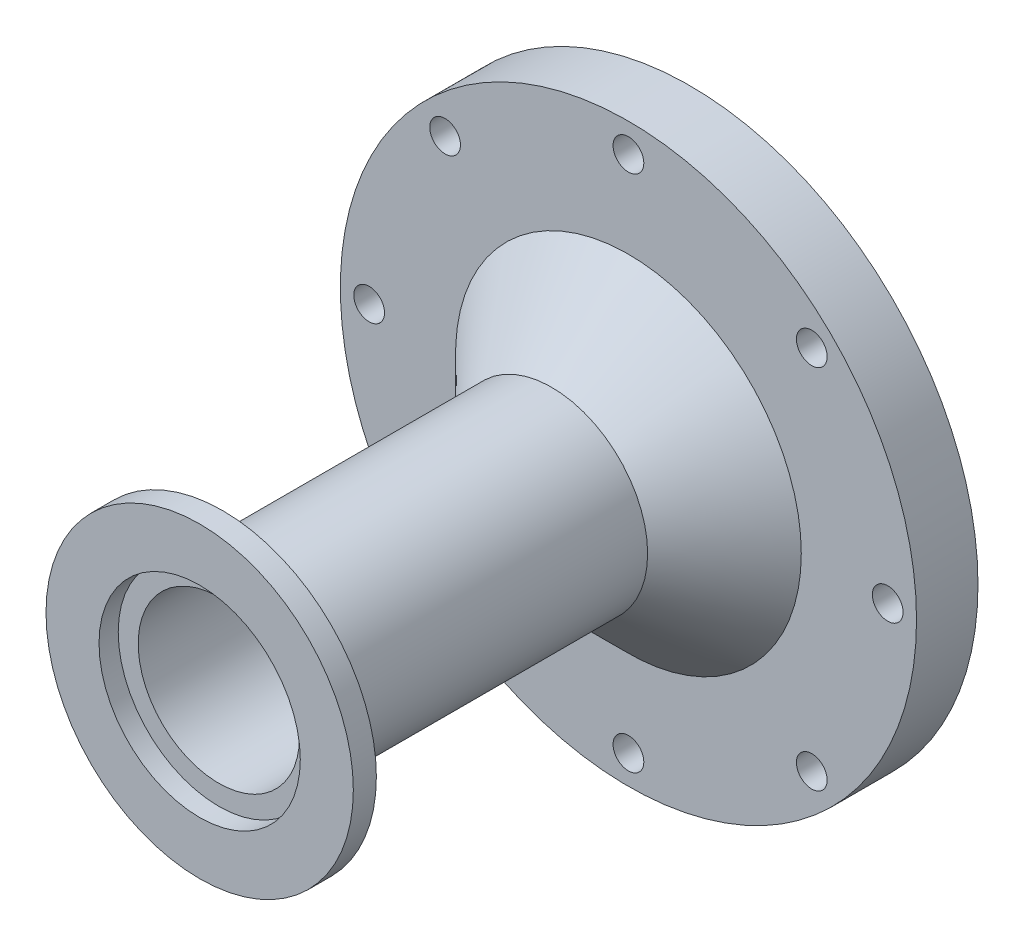
ISO-10303-21;
HEADER;
FILE_DESCRIPTION(('STEP AP214'),'2;1');
FILE_NAME('part.step','',(''),(''),'','','');
FILE_SCHEMA(('AUTOMOTIVE_DESIGN { 1 0 10303 214 1 1 1 1 }'));
ENDSEC;
DATA;
#1=APPLICATION_CONTEXT('core data for automotive mechanical design processes');
#2=APPLICATION_PROTOCOL_DEFINITION('international standard','automotive_design',2000,#1);
#3=PRODUCT_CONTEXT('',#1,'mechanical');
#4=PRODUCT('Part','Part','',(#3));
#5=PRODUCT_RELATED_PRODUCT_CATEGORY('part','',(#4));
#6=PRODUCT_DEFINITION_FORMATION('','',#4);
#7=PRODUCT_DEFINITION_CONTEXT('part definition',#1,'design');
#8=PRODUCT_DEFINITION('design','',#6,#7);
#9=PRODUCT_DEFINITION_SHAPE('','',#8);
#10=(LENGTH_UNIT() NAMED_UNIT(*) SI_UNIT(.MILLI.,.METRE.));
#11=(NAMED_UNIT(*) PLANE_ANGLE_UNIT() SI_UNIT($,.RADIAN.));
#12=(NAMED_UNIT(*) SI_UNIT($,.STERADIAN.) SOLID_ANGLE_UNIT());
#13=UNCERTAINTY_MEASURE_WITH_UNIT(LENGTH_MEASURE(1.E-05),#10,'distance_accuracy_value','');
#14=(GEOMETRIC_REPRESENTATION_CONTEXT(3) GLOBAL_UNCERTAINTY_ASSIGNED_CONTEXT((#13)) GLOBAL_UNIT_ASSIGNED_CONTEXT((#10,
#11,#12)) REPRESENTATION_CONTEXT('',''));
#15=CARTESIAN_POINT('',(0.,0.,0.));
#16=DIRECTION('',(0.,0.,1.));
#17=DIRECTION('',(1.,0.,0.));
#18=AXIS2_PLACEMENT_3D('',#15,#16,#17);
#19=CARTESIAN_POINT('',(0.,0.,58.8));
#20=DIRECTION('',(0.,0.,-1.));
#21=DIRECTION('',(-1.,0.,0.));
#22=AXIS2_PLACEMENT_3D('',#19,#20,#21);
#23=CYLINDRICAL_SURFACE('',#22,10.5);
#24=CARTESIAN_POINT('',(0.,0.,0.));
#25=DIRECTION('',(0.,0.,1.));
#26=DIRECTION('',(1.,0.,0.));
#27=AXIS2_PLACEMENT_3D('',#24,#25,#26);
#28=CIRCLE('',#27,10.5);
#29=CARTESIAN_POINT('',(10.5,0.,0.));
#30=VERTEX_POINT('',#29);
#31=EDGE_CURVE('E124',#30,#30,#28,.T.);
#32=ORIENTED_EDGE('',*,*,#31,.F.);
#33=EDGE_LOOP('',(#32));
#34=FACE_BOUND('',#33,.T.);
#35=CARTESIAN_POINT('',(0.,0.,61.31));
#36=DIRECTION('',(0.,0.,1.));
#37=DIRECTION('',(1.,0.,0.));
#38=AXIS2_PLACEMENT_3D('',#35,#36,#37);
#39=CIRCLE('',#38,10.5);
#40=CARTESIAN_POINT('',(10.5,0.,61.31));
#41=VERTEX_POINT('',#40);
#42=EDGE_CURVE('E51',#41,#41,#39,.T.);
#43=ORIENTED_EDGE('',*,*,#42,.T.);
#44=EDGE_LOOP('',(#43));
#45=FACE_BOUND('',#44,.T.);
#46=ADVANCED_FACE('F33',(#34,#45),#23,.F.);
#47=CARTESIAN_POINT('',(0.,0.,8.));
#48=DIRECTION('',(0.,0.,1.));
#49=DIRECTION('',(1.,0.,0.));
#50=AXIS2_PLACEMENT_3D('',#47,#48,#49);
#51=PLANE('',#50);
#52=CARTESIAN_POINT('',(0.,0.,8.));
#53=DIRECTION('',(0.,0.,1.));
#54=DIRECTION('',(1.,0.,0.));
#55=AXIS2_PLACEMENT_3D('',#52,#53,#54);
#56=CIRCLE('',#55,22.5);
#57=CARTESIAN_POINT('',(22.5,0.,8.));
#58=VERTEX_POINT('',#57);
#59=EDGE_CURVE('E10',#58,#58,#56,.F.);
#60=ORIENTED_EDGE('',*,*,#59,.T.);
#61=EDGE_LOOP('',(#60));
#62=FACE_BOUND('',#61,.T.);
#63=CARTESIAN_POINT('',(33.75,0.,8.));
#64=DIRECTION('',(0.,0.,1.));
#65=DIRECTION('',(1.,0.,0.));
#66=AXIS2_PLACEMENT_3D('',#63,#64,#65);
#67=CIRCLE('',#66,2.);
#68=CARTESIAN_POINT('',(35.75,0.,8.));
#69=VERTEX_POINT('',#68);
#70=EDGE_CURVE('E92',#69,#69,#67,.T.);
#71=ORIENTED_EDGE('',*,*,#70,.F.);
#72=EDGE_LOOP('',(#71));
#73=FACE_BOUND('',#72,.T.);
#74=CARTESIAN_POINT('',(-7.23379689482329E-13,-33.7500000000001,8.));
#75=DIRECTION('',(0.,0.,1.));
#76=DIRECTION('',(1.,0.,0.));
#77=AXIS2_PLACEMENT_3D('',#74,#75,#76);
#78=CIRCLE('',#77,2.00000000000001);
#79=CARTESIAN_POINT('',(1.99999999999928,-33.7500000000001,8.));
#80=VERTEX_POINT('',#79);
#81=EDGE_CURVE('E80',#80,#80,#78,.T.);
#82=ORIENTED_EDGE('',*,*,#81,.F.);
#83=EDGE_LOOP('',(#82));
#84=FACE_BOUND('',#83,.T.);
#85=CARTESIAN_POINT('',(-33.7500000000002,1.85615411929518E-13,8.));
#86=DIRECTION('',(0.,0.,1.));
#87=DIRECTION('',(1.,0.,0.));
#88=AXIS2_PLACEMENT_3D('',#85,#86,#87);
#89=CIRCLE('',#88,2.00000000000001);
#90=CARTESIAN_POINT('',(-31.7500000000002,1.85615411929518E-13,8.));
#91=VERTEX_POINT('',#90);
#92=EDGE_CURVE('E68',#91,#91,#89,.T.);
#93=ORIENTED_EDGE('',*,*,#92,.F.);
#94=EDGE_LOOP('',(#93));
#95=FACE_BOUND('',#94,.T.);
#96=CARTESIAN_POINT('',(3.48471251854221E-13,33.75,8.));
#97=DIRECTION('',(0.,0.,1.));
#98=DIRECTION('',(1.,0.,0.));
#99=AXIS2_PLACEMENT_3D('',#96,#97,#98);
#100=CIRCLE('',#99,2.);
#101=CARTESIAN_POINT('',(2.00000000000035,33.75,8.));
#102=VERTEX_POINT('',#101);
#103=EDGE_CURVE('E57',#102,#102,#100,.T.);
#104=ORIENTED_EDGE('',*,*,#103,.F.);
#105=EDGE_LOOP('',(#104));
#106=FACE_BOUND('',#105,.T.);
#107=CARTESIAN_POINT('',(0.,0.,8.));
#108=DIRECTION('',(0.,0.,1.));
#109=DIRECTION('',(1.,0.,0.));
#110=AXIS2_PLACEMENT_3D('',#107,#108,#109);
#111=CIRCLE('',#110,37.5);
#112=CARTESIAN_POINT('',(37.5,0.,8.));
#113=VERTEX_POINT('',#112);
#114=EDGE_CURVE('E44',#113,#113,#111,.T.);
#115=ORIENTED_EDGE('',*,*,#114,.T.);
#116=EDGE_LOOP('',(#115));
#117=FACE_BOUND('',#116,.T.);
#118=CARTESIAN_POINT('',(-23.8648538650459,23.8648538650462,8.));
#119=DIRECTION('',(0.,0.,1.));
#120=DIRECTION('',(1.,0.,0.));
#121=AXIS2_PLACEMENT_3D('',#118,#119,#120);
#122=CIRCLE('',#121,2.00000000000001);
#123=CARTESIAN_POINT('',(-21.8648538650459,23.8648538650462,8.));
#124=VERTEX_POINT('',#123);
#125=EDGE_CURVE('E62',#124,#124,#122,.T.);
#126=ORIENTED_EDGE('',*,*,#125,.F.);
#127=EDGE_LOOP('',(#126));
#128=FACE_BOUND('',#127,.T.);
#129=CARTESIAN_POINT('',(-23.8648538650466,-23.8648538650456,8.));
#130=DIRECTION('',(0.,0.,1.));
#131=DIRECTION('',(1.,0.,0.));
#132=AXIS2_PLACEMENT_3D('',#129,#130,#131);
#133=CIRCLE('',#132,2.00000000000001);
#134=CARTESIAN_POINT('',(-21.8648538650466,-23.8648538650456,8.));
#135=VERTEX_POINT('',#134);
#136=EDGE_CURVE('E74',#135,#135,#133,.T.);
#137=ORIENTED_EDGE('',*,*,#136,.F.);
#138=EDGE_LOOP('',(#137));
#139=FACE_BOUND('',#138,.T.);
#140=CARTESIAN_POINT('',(23.8648538650455,-23.8648538650465,8.));
#141=DIRECTION('',(0.,0.,1.));
#142=DIRECTION('',(1.,0.,0.));
#143=AXIS2_PLACEMENT_3D('',#140,#141,#142);
#144=CIRCLE('',#143,2.);
#145=CARTESIAN_POINT('',(25.8648538650455,-23.8648538650465,8.));
#146=VERTEX_POINT('',#145);
#147=EDGE_CURVE('E86',#146,#146,#144,.T.);
#148=ORIENTED_EDGE('',*,*,#147,.F.);
#149=EDGE_LOOP('',(#148));
#150=FACE_BOUND('',#149,.T.);
#151=CARTESIAN_POINT('',(23.8648538650463,23.8648538650457,8.));
#152=DIRECTION('',(0.,0.,1.));
#153=DIRECTION('',(1.,0.,0.));
#154=AXIS2_PLACEMENT_3D('',#151,#152,#153);
#155=CIRCLE('',#154,2.);
#156=CARTESIAN_POINT('',(25.8648538650463,23.8648538650457,8.));
#157=VERTEX_POINT('',#156);
#158=EDGE_CURVE('E98',#157,#157,#155,.T.);
#159=ORIENTED_EDGE('',*,*,#158,.F.);
#160=EDGE_LOOP('',(#159));
#161=FACE_BOUND('',#160,.T.);
#162=ADVANCED_FACE('F173',(#62,#73,#84,#95,#106,#117,#128,#139,#150,#161),#51,.T.);
#163=CARTESIAN_POINT('',(0.,0.,0.));
#164=DIRECTION('',(0.,0.,1.));
#165=DIRECTION('',(1.,0.,0.));
#166=AXIS2_PLACEMENT_3D('',#163,#164,#165);
#167=PLANE('',#166);
#168=CARTESIAN_POINT('',(33.75,0.,0.));
#169=DIRECTION('',(0.,0.,1.));
#170=DIRECTION('',(1.,0.,0.));
#171=AXIS2_PLACEMENT_3D('',#168,#169,#170);
#172=CIRCLE('',#171,2.);
#173=CARTESIAN_POINT('',(35.75,0.,0.));
#174=VERTEX_POINT('',#173);
#175=EDGE_CURVE('E95',#174,#174,#172,.T.);
#176=ORIENTED_EDGE('',*,*,#175,.T.);
#177=EDGE_LOOP('',(#176));
#178=FACE_BOUND('',#177,.T.);
#179=CARTESIAN_POINT('',(-7.23379689482329E-13,-33.7500000000001,0.));
#180=DIRECTION('',(0.,0.,1.));
#181=DIRECTION('',(1.,0.,0.));
#182=AXIS2_PLACEMENT_3D('',#179,#180,#181);
#183=CIRCLE('',#182,2.00000000000001);
#184=CARTESIAN_POINT('',(1.99999999999928,-33.7500000000001,0.));
#185=VERTEX_POINT('',#184);
#186=EDGE_CURVE('E83',#185,#185,#183,.T.);
#187=ORIENTED_EDGE('',*,*,#186,.T.);
#188=EDGE_LOOP('',(#187));
#189=FACE_BOUND('',#188,.T.);
#190=CARTESIAN_POINT('',(-33.7500000000002,1.85615411929518E-13,0.));
#191=DIRECTION('',(0.,0.,1.));
#192=DIRECTION('',(1.,0.,0.));
#193=AXIS2_PLACEMENT_3D('',#190,#191,#192);
#194=CIRCLE('',#193,2.00000000000001);
#195=CARTESIAN_POINT('',(-31.7500000000002,1.85615411929518E-13,0.));
#196=VERTEX_POINT('',#195);
#197=EDGE_CURVE('E71',#196,#196,#194,.T.);
#198=ORIENTED_EDGE('',*,*,#197,.T.);
#199=EDGE_LOOP('',(#198));
#200=FACE_BOUND('',#199,.T.);
#201=CARTESIAN_POINT('',(3.48471251854221E-13,33.75,0.));
#202=DIRECTION('',(0.,0.,1.));
#203=DIRECTION('',(1.,0.,0.));
#204=AXIS2_PLACEMENT_3D('',#201,#202,#203);
#205=CIRCLE('',#204,2.);
#206=CARTESIAN_POINT('',(2.00000000000035,33.75,0.));
#207=VERTEX_POINT('',#206);
#208=EDGE_CURVE('E59',#207,#207,#205,.T.);
#209=ORIENTED_EDGE('',*,*,#208,.T.);
#210=EDGE_LOOP('',(#209));
#211=FACE_BOUND('',#210,.T.);
#212=CARTESIAN_POINT('',(0.,0.,0.));
#213=DIRECTION('',(0.,0.,1.));
#214=DIRECTION('',(1.,0.,0.));
#215=AXIS2_PLACEMENT_3D('',#212,#213,#214);
#216=CIRCLE('',#215,37.5);
#217=CARTESIAN_POINT('',(37.5,0.,0.));
#218=VERTEX_POINT('',#217);
#219=EDGE_CURVE('E48',#218,#218,#216,.T.);
#220=ORIENTED_EDGE('',*,*,#219,.F.);
#221=EDGE_LOOP('',(#220));
#222=FACE_BOUND('',#221,.T.);
#223=CARTESIAN_POINT('',(-23.8648538650459,23.8648538650462,0.));
#224=DIRECTION('',(0.,0.,1.));
#225=DIRECTION('',(1.,0.,0.));
#226=AXIS2_PLACEMENT_3D('',#223,#224,#225);
#227=CIRCLE('',#226,2.00000000000001);
#228=CARTESIAN_POINT('',(-21.8648538650459,23.8648538650462,0.));
#229=VERTEX_POINT('',#228);
#230=EDGE_CURVE('E65',#229,#229,#227,.T.);
#231=ORIENTED_EDGE('',*,*,#230,.T.);
#232=EDGE_LOOP('',(#231));
#233=FACE_BOUND('',#232,.T.);
#234=CARTESIAN_POINT('',(-23.8648538650466,-23.8648538650456,0.));
#235=DIRECTION('',(0.,0.,1.));
#236=DIRECTION('',(1.,0.,0.));
#237=AXIS2_PLACEMENT_3D('',#234,#235,#236);
#238=CIRCLE('',#237,2.00000000000001);
#239=CARTESIAN_POINT('',(-21.8648538650466,-23.8648538650456,0.));
#240=VERTEX_POINT('',#239);
#241=EDGE_CURVE('E77',#240,#240,#238,.T.);
#242=ORIENTED_EDGE('',*,*,#241,.T.);
#243=EDGE_LOOP('',(#242));
#244=FACE_BOUND('',#243,.T.);
#245=CARTESIAN_POINT('',(23.8648538650455,-23.8648538650465,0.));
#246=DIRECTION('',(0.,0.,1.));
#247=DIRECTION('',(1.,0.,0.));
#248=AXIS2_PLACEMENT_3D('',#245,#246,#247);
#249=CIRCLE('',#248,2.);
#250=CARTESIAN_POINT('',(25.8648538650455,-23.8648538650465,0.));
#251=VERTEX_POINT('',#250);
#252=EDGE_CURVE('E89',#251,#251,#249,.T.);
#253=ORIENTED_EDGE('',*,*,#252,.T.);
#254=EDGE_LOOP('',(#253));
#255=FACE_BOUND('',#254,.T.);
#256=CARTESIAN_POINT('',(23.8648538650463,23.8648538650457,0.));
#257=DIRECTION('',(0.,0.,1.));
#258=DIRECTION('',(1.,0.,0.));
#259=AXIS2_PLACEMENT_3D('',#256,#257,#258);
#260=CIRCLE('',#259,2.);
#261=CARTESIAN_POINT('',(25.8648538650463,23.8648538650457,0.));
#262=VERTEX_POINT('',#261);
#263=EDGE_CURVE('E101',#262,#262,#260,.T.);
#264=ORIENTED_EDGE('',*,*,#263,.T.);
#265=EDGE_LOOP('',(#264));
#266=FACE_BOUND('',#265,.T.);
#267=CARTESIAN_POINT('',(0.,0.,0.));
#268=DIRECTION('',(0.,0.,1.));
#269=DIRECTION('',(1.,0.,0.));
#270=AXIS2_PLACEMENT_3D('',#267,#268,#269);
#271=CIRCLE('',#270,20.71);
#272=CARTESIAN_POINT('',(20.71,0.,0.));
#273=VERTEX_POINT('',#272);
#274=EDGE_CURVE('E107',#273,#273,#271,.T.);
#275=ORIENTED_EDGE('',*,*,#274,.T.);
#276=EDGE_LOOP('',(#275));
#277=FACE_BOUND('',#276,.T.);
#278=ADVANCED_FACE('F178',(#178,#189,#200,#211,#222,#233,#244,#255,#266,#277),#167,.F.);
#279=ORIENTED_EDGE('',*,*,#31,.T.);
#280=EDGE_LOOP('',(#279));
#281=FACE_BOUND('',#280,.T.);
#282=CARTESIAN_POINT('',(0.,0.,0.));
#283=DIRECTION('',(0.,0.,1.));
#284=DIRECTION('',(1.,0.,0.));
#285=AXIS2_PLACEMENT_3D('',#282,#283,#284);
#286=CIRCLE('',#285,19.21);
#287=CARTESIAN_POINT('',(19.21,0.,0.));
#288=VERTEX_POINT('',#287);
#289=EDGE_CURVE('E113',#288,#288,#286,.T.);
#290=ORIENTED_EDGE('',*,*,#289,.F.);
#291=EDGE_LOOP('',(#290));
#292=FACE_BOUND('',#291,.T.);
#293=ADVANCED_FACE('F239',(#281,#292),#167,.F.);
#294=CARTESIAN_POINT('',(0.,0.,8.));
#295=DIRECTION('',(0.,0.,-1.));
#296=DIRECTION('',(-1.,0.,0.));
#297=AXIS2_PLACEMENT_3D('',#294,#295,#296);
#298=CYLINDRICAL_SURFACE('',#297,37.5);
#299=ORIENTED_EDGE('',*,*,#114,.F.);
#300=EDGE_LOOP('',(#299));
#301=FACE_BOUND('',#300,.T.);
#302=ORIENTED_EDGE('',*,*,#219,.T.);
#303=EDGE_LOOP('',(#302));
#304=FACE_BOUND('',#303,.T.);
#305=ADVANCED_FACE('F244',(#301,#304),#298,.T.);
#306=CARTESIAN_POINT('',(3.48471251854221E-13,33.75,8.));
#307=DIRECTION('',(0.,0.,-1.));
#308=DIRECTION('',(-1.,0.,0.));
#309=AXIS2_PLACEMENT_3D('',#306,#307,#308);
#310=CYLINDRICAL_SURFACE('',#309,2.);
#311=ORIENTED_EDGE('',*,*,#103,.T.);
#312=EDGE_LOOP('',(#311));
#313=FACE_BOUND('',#312,.T.);
#314=ORIENTED_EDGE('',*,*,#208,.F.);
#315=EDGE_LOOP('',(#314));
#316=FACE_BOUND('',#315,.T.);
#317=ADVANCED_FACE('F354',(#313,#316),#310,.F.);
#318=CARTESIAN_POINT('',(-23.8648538650459,23.8648538650462,8.));
#319=DIRECTION('',(0.,0.,-1.));
#320=DIRECTION('',(-1.,0.,0.));
#321=AXIS2_PLACEMENT_3D('',#318,#319,#320);
#322=CYLINDRICAL_SURFACE('',#321,2.00000000000001);
#323=ORIENTED_EDGE('',*,*,#125,.T.);
#324=EDGE_LOOP('',(#323));
#325=FACE_BOUND('',#324,.T.);
#326=ORIENTED_EDGE('',*,*,#230,.F.);
#327=EDGE_LOOP('',(#326));
#328=FACE_BOUND('',#327,.T.);
#329=ADVANCED_FACE('F344',(#325,#328),#322,.F.);
#330=CARTESIAN_POINT('',(-33.7500000000002,1.85615411929518E-13,8.));
#331=DIRECTION('',(0.,0.,-1.));
#332=DIRECTION('',(-1.,0.,0.));
#333=AXIS2_PLACEMENT_3D('',#330,#331,#332);
#334=CYLINDRICAL_SURFACE('',#333,2.00000000000001);
#335=ORIENTED_EDGE('',*,*,#92,.T.);
#336=EDGE_LOOP('',(#335));
#337=FACE_BOUND('',#336,.T.);
#338=ORIENTED_EDGE('',*,*,#197,.F.);
#339=EDGE_LOOP('',(#338));
#340=FACE_BOUND('',#339,.T.);
#341=ADVANCED_FACE('F334',(#337,#340),#334,.F.);
#342=CARTESIAN_POINT('',(-23.8648538650466,-23.8648538650456,8.));
#343=DIRECTION('',(0.,0.,-1.));
#344=DIRECTION('',(-1.,0.,0.));
#345=AXIS2_PLACEMENT_3D('',#342,#343,#344);
#346=CYLINDRICAL_SURFACE('',#345,2.00000000000001);
#347=ORIENTED_EDGE('',*,*,#136,.T.);
#348=EDGE_LOOP('',(#347));
#349=FACE_BOUND('',#348,.T.);
#350=ORIENTED_EDGE('',*,*,#241,.F.);
#351=EDGE_LOOP('',(#350));
#352=FACE_BOUND('',#351,.T.);
#353=ADVANCED_FACE('F324',(#349,#352),#346,.F.);
#354=CARTESIAN_POINT('',(-7.23379689482329E-13,-33.7500000000001,8.));
#355=DIRECTION('',(0.,0.,-1.));
#356=DIRECTION('',(-1.,0.,0.));
#357=AXIS2_PLACEMENT_3D('',#354,#355,#356);
#358=CYLINDRICAL_SURFACE('',#357,2.00000000000001);
#359=ORIENTED_EDGE('',*,*,#81,.T.);
#360=EDGE_LOOP('',(#359));
#361=FACE_BOUND('',#360,.T.);
#362=ORIENTED_EDGE('',*,*,#186,.F.);
#363=EDGE_LOOP('',(#362));
#364=FACE_BOUND('',#363,.T.);
#365=ADVANCED_FACE('F314',(#361,#364),#358,.F.);
#366=CARTESIAN_POINT('',(23.8648538650455,-23.8648538650465,8.));
#367=DIRECTION('',(0.,0.,-1.));
#368=DIRECTION('',(-1.,0.,0.));
#369=AXIS2_PLACEMENT_3D('',#366,#367,#368);
#370=CYLINDRICAL_SURFACE('',#369,2.);
#371=ORIENTED_EDGE('',*,*,#147,.T.);
#372=EDGE_LOOP('',(#371));
#373=FACE_BOUND('',#372,.T.);
#374=ORIENTED_EDGE('',*,*,#252,.F.);
#375=EDGE_LOOP('',(#374));
#376=FACE_BOUND('',#375,.T.);
#377=ADVANCED_FACE('F304',(#373,#376),#370,.F.);
#378=CARTESIAN_POINT('',(33.75,0.,8.));
#379=DIRECTION('',(0.,0.,-1.));
#380=DIRECTION('',(-1.,0.,0.));
#381=AXIS2_PLACEMENT_3D('',#378,#379,#380);
#382=CYLINDRICAL_SURFACE('',#381,2.);
#383=ORIENTED_EDGE('',*,*,#70,.T.);
#384=EDGE_LOOP('',(#383));
#385=FACE_BOUND('',#384,.T.);
#386=ORIENTED_EDGE('',*,*,#175,.F.);
#387=EDGE_LOOP('',(#386));
#388=FACE_BOUND('',#387,.T.);
#389=ADVANCED_FACE('F294',(#385,#388),#382,.F.);
#390=CARTESIAN_POINT('',(23.8648538650463,23.8648538650457,8.));
#391=DIRECTION('',(0.,0.,-1.));
#392=DIRECTION('',(-1.,0.,0.));
#393=AXIS2_PLACEMENT_3D('',#390,#391,#392);
#394=CYLINDRICAL_SURFACE('',#393,2.);
#395=ORIENTED_EDGE('',*,*,#158,.T.);
#396=EDGE_LOOP('',(#395));
#397=FACE_BOUND('',#396,.T.);
#398=ORIENTED_EDGE('',*,*,#263,.F.);
#399=EDGE_LOOP('',(#398));
#400=FACE_BOUND('',#399,.T.);
#401=ADVANCED_FACE('F277',(#397,#400),#394,.F.);
#402=CARTESIAN_POINT('',(0.,0.,2.));
#403=DIRECTION('',(0.,0.,1.));
#404=DIRECTION('',(1.,0.,0.));
#405=AXIS2_PLACEMENT_3D('',#402,#403,#404);
#406=PLANE('',#405);
#407=CARTESIAN_POINT('',(0.,0.,2.));
#408=DIRECTION('',(0.,0.,1.));
#409=DIRECTION('',(1.,0.,0.));
#410=AXIS2_PLACEMENT_3D('',#407,#408,#409);
#411=CIRCLE('',#410,20.71);
#412=CARTESIAN_POINT('',(20.71,0.,2.));
#413=VERTEX_POINT('',#412);
#414=EDGE_CURVE('E104',#413,#413,#411,.T.);
#415=ORIENTED_EDGE('',*,*,#414,.F.);
#416=EDGE_LOOP('',(#415));
#417=FACE_BOUND('',#416,.T.);
#418=CARTESIAN_POINT('',(0.,0.,2.));
#419=DIRECTION('',(0.,0.,1.));
#420=DIRECTION('',(1.,0.,0.));
#421=AXIS2_PLACEMENT_3D('',#418,#419,#420);
#422=CIRCLE('',#421,19.21);
#423=CARTESIAN_POINT('',(19.21,0.,2.));
#424=VERTEX_POINT('',#423);
#425=EDGE_CURVE('E110',#424,#424,#422,.T.);
#426=ORIENTED_EDGE('',*,*,#425,.T.);
#427=EDGE_LOOP('',(#426));
#428=FACE_BOUND('',#427,.T.);
#429=ADVANCED_FACE('F267',(#417,#428),#406,.F.);
#430=CARTESIAN_POINT('',(0.,0.,2.));
#431=DIRECTION('',(0.,0.,-1.));
#432=DIRECTION('',(-1.,0.,0.));
#433=AXIS2_PLACEMENT_3D('',#430,#431,#432);
#434=CYLINDRICAL_SURFACE('',#433,20.71);
#435=ORIENTED_EDGE('',*,*,#414,.T.);
#436=EDGE_LOOP('',(#435));
#437=FACE_BOUND('',#436,.T.);
#438=ORIENTED_EDGE('',*,*,#274,.F.);
#439=EDGE_LOOP('',(#438));
#440=FACE_BOUND('',#439,.T.);
#441=ADVANCED_FACE('F168',(#437,#440),#434,.F.);
#442=CARTESIAN_POINT('',(0.,0.,2.));
#443=DIRECTION('',(0.,0.,-1.));
#444=DIRECTION('',(-1.,0.,0.));
#445=AXIS2_PLACEMENT_3D('',#442,#443,#444);
#446=CYLINDRICAL_SURFACE('',#445,19.21);
#447=ORIENTED_EDGE('',*,*,#425,.F.);
#448=EDGE_LOOP('',(#447));
#449=FACE_BOUND('',#448,.T.);
#450=ORIENTED_EDGE('',*,*,#289,.T.);
#451=EDGE_LOOP('',(#450));
#452=FACE_BOUND('',#451,.T.);
#453=ADVANCED_FACE('F163',(#449,#452),#446,.T.);
#454=CARTESIAN_POINT('',(0.,0.,58.8));
#455=DIRECTION('',(0.,0.,-1.));
#456=DIRECTION('',(-1.,0.,0.));
#457=AXIS2_PLACEMENT_3D('',#454,#455,#456);
#458=CYLINDRICAL_SURFACE('',#457,12.5);
#459=CARTESIAN_POINT('',(0.,0.,18.0000000000001));
#460=DIRECTION('',(0.,0.,1.));
#461=DIRECTION('',(1.,0.,0.));
#462=AXIS2_PLACEMENT_3D('',#459,#460,#461);
#463=CIRCLE('',#462,12.5);
#464=CARTESIAN_POINT('',(12.5,0.,18.0000000000001));
#465=VERTEX_POINT('',#464);
#466=EDGE_CURVE('E40',#465,#465,#463,.T.);
#467=ORIENTED_EDGE('',*,*,#466,.T.);
#468=EDGE_LOOP('',(#467));
#469=FACE_BOUND('',#468,.T.);
#470=CARTESIAN_POINT('',(0.,0.,58.8));
#471=DIRECTION('',(0.,0.,1.));
#472=DIRECTION('',(1.,0.,0.));
#473=AXIS2_PLACEMENT_3D('',#470,#471,#472);
#474=CIRCLE('',#473,12.5);
#475=CARTESIAN_POINT('',(12.5,0.,58.8));
#476=VERTEX_POINT('',#475);
#477=EDGE_CURVE('E116',#476,#476,#474,.T.);
#478=ORIENTED_EDGE('',*,*,#477,.F.);
#479=EDGE_LOOP('',(#478));
#480=FACE_BOUND('',#479,.T.);
#481=ADVANCED_FACE('F158',(#469,#480),#458,.T.);
#482=CARTESIAN_POINT('',(0.,0.,58.8));
#483=DIRECTION('',(0.,0.,1.));
#484=DIRECTION('',(1.,0.,0.));
#485=AXIS2_PLACEMENT_3D('',#482,#483,#484);
#486=CONICAL_SURFACE('',#485,12.5,1.30899693899575);
#487=CARTESIAN_POINT('',(0.,0.,60.81));
#488=DIRECTION('',(0.,0.,1.));
#489=DIRECTION('',(1.,0.,0.));
#490=AXIS2_PLACEMENT_3D('',#487,#488,#489);
#491=CIRCLE('',#490,20.0014221232135);
#492=CARTESIAN_POINT('',(20.0014221232135,0.,60.81));
#493=VERTEX_POINT('',#492);
#494=EDGE_CURVE('E121',#493,#493,#491,.T.);
#495=ORIENTED_EDGE('',*,*,#494,.F.);
#496=EDGE_LOOP('',(#495));
#497=FACE_BOUND('',#496,.T.);
#498=ORIENTED_EDGE('',*,*,#477,.T.);
#499=EDGE_LOOP('',(#498));
#500=FACE_BOUND('',#499,.T.);
#501=ADVANCED_FACE('F147',(#497,#500),#486,.T.);
#502=CARTESIAN_POINT('',(0.,0.,63.81));
#503=DIRECTION('',(0.,0.,1.));
#504=DIRECTION('',(1.,0.,0.));
#505=AXIS2_PLACEMENT_3D('',#502,#503,#504);
#506=PLANE('',#505);
#507=CARTESIAN_POINT('',(0.,0.,63.81));
#508=DIRECTION('',(0.,0.,1.));
#509=DIRECTION('',(1.,0.,0.));
#510=AXIS2_PLACEMENT_3D('',#507,#508,#509);
#511=CIRCLE('',#510,13.1);
#512=CARTESIAN_POINT('',(13.1,0.,63.81));
#513=VERTEX_POINT('',#512);
#514=EDGE_CURVE('E129',#513,#513,#511,.T.);
#515=ORIENTED_EDGE('',*,*,#514,.F.);
#516=EDGE_LOOP('',(#515));
#517=FACE_BOUND('',#516,.T.);
#518=CARTESIAN_POINT('',(0.,0.,63.81));
#519=DIRECTION('',(0.,0.,1.));
#520=DIRECTION('',(1.,0.,0.));
#521=AXIS2_PLACEMENT_3D('',#518,#519,#520);
#522=CIRCLE('',#521,20.0014221232135);
#523=CARTESIAN_POINT('',(20.0014221232135,0.,63.81));
#524=VERTEX_POINT('',#523);
#525=EDGE_CURVE('E54',#524,#524,#522,.T.);
#526=ORIENTED_EDGE('',*,*,#525,.T.);
#527=EDGE_LOOP('',(#526));
#528=FACE_BOUND('',#527,.T.);
#529=ADVANCED_FACE('F144',(#517,#528),#506,.T.);
#530=CARTESIAN_POINT('',(0.,0.,63.81));
#531=DIRECTION('',(0.,0.,-1.));
#532=DIRECTION('',(-1.,0.,0.));
#533=AXIS2_PLACEMENT_3D('',#530,#531,#532);
#534=CYLINDRICAL_SURFACE('',#533,20.0014221232135);
#535=ORIENTED_EDGE('',*,*,#525,.F.);
#536=EDGE_LOOP('',(#535));
#537=FACE_BOUND('',#536,.T.);
#538=ORIENTED_EDGE('',*,*,#494,.T.);
#539=EDGE_LOOP('',(#538));
#540=FACE_BOUND('',#539,.T.);
#541=ADVANCED_FACE('F140',(#537,#540),#534,.T.);
#542=CARTESIAN_POINT('',(0.,0.,61.31));
#543=DIRECTION('',(0.,0.,1.));
#544=DIRECTION('',(1.,0.,0.));
#545=AXIS2_PLACEMENT_3D('',#542,#543,#544);
#546=CYLINDRICAL_SURFACE('',#545,13.1);
#547=CARTESIAN_POINT('',(0.,0.,61.31));
#548=DIRECTION('',(0.,0.,1.));
#549=DIRECTION('',(1.,0.,0.));
#550=AXIS2_PLACEMENT_3D('',#547,#548,#549);
#551=CIRCLE('',#550,13.1);
#552=CARTESIAN_POINT('',(13.1,0.,61.31));
#553=VERTEX_POINT('',#552);
#554=EDGE_CURVE('E55',#553,#553,#551,.T.);
#555=ORIENTED_EDGE('',*,*,#554,.F.);
#556=EDGE_LOOP('',(#555));
#557=FACE_BOUND('',#556,.T.);
#558=ORIENTED_EDGE('',*,*,#514,.T.);
#559=EDGE_LOOP('',(#558));
#560=FACE_BOUND('',#559,.T.);
#561=ADVANCED_FACE('F137',(#557,#560),#546,.F.);
#562=CARTESIAN_POINT('',(0.,0.,61.31));
#563=DIRECTION('',(0.,0.,1.));
#564=DIRECTION('',(1.,0.,0.));
#565=AXIS2_PLACEMENT_3D('',#562,#563,#564);
#566=PLANE('',#565);
#567=ORIENTED_EDGE('',*,*,#42,.F.);
#568=EDGE_LOOP('',(#567));
#569=FACE_BOUND('',#568,.T.);
#570=ORIENTED_EDGE('',*,*,#554,.T.);
#571=EDGE_LOOP('',(#570));
#572=FACE_BOUND('',#571,.T.);
#573=ADVANCED_FACE('F135',(#569,#572),#566,.T.);
#574=CARTESIAN_POINT('',(0.,0.,18.0000000000001));
#575=DIRECTION('',(0.,0.,-1.));
#576=DIRECTION('',(-1.,0.,0.));
#577=AXIS2_PLACEMENT_3D('',#574,#575,#576);
#578=CONICAL_SURFACE('',#577,12.5,0.785398163397443);
#579=ORIENTED_EDGE('',*,*,#59,.F.);
#580=EDGE_LOOP('',(#579));
#581=FACE_BOUND('',#580,.T.);
#582=ORIENTED_EDGE('',*,*,#466,.F.);
#583=EDGE_LOOP('',(#582));
#584=FACE_BOUND('',#583,.T.);
#585=ADVANCED_FACE('F35',(#581,#584),#578,.T.);
#586=CLOSED_SHELL('',(#46,#162,#278,#293,#305,#317,#329,#341,#353,#365,#377,#389,#401,#429,#441,
#453,#481,#501,#529,#541,#561,#573,#585));
#587=MANIFOLD_SOLID_BREP('B2',#586);
#588=ADVANCED_BREP_SHAPE_REPRESENTATION('',(#18,#587),#14);
#589=SHAPE_DEFINITION_REPRESENTATION(#9,#588);
ENDSEC;
END-ISO-10303-21;
